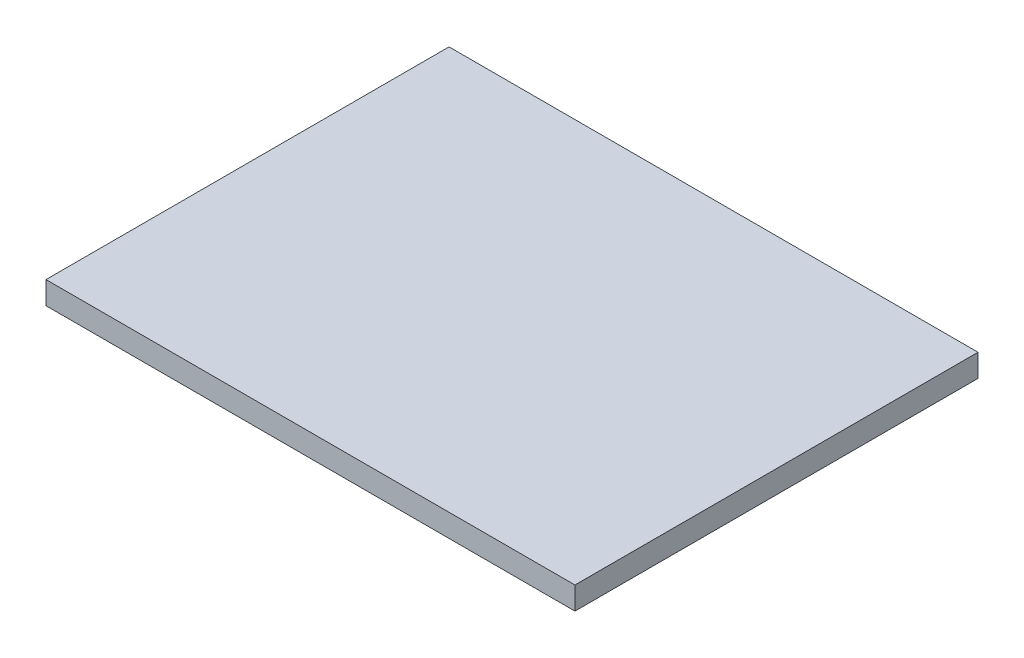
ISO-10303-21;
HEADER;
FILE_DESCRIPTION(('STEP AP214'),'2;1');
FILE_NAME('part.step','',(''),(''),'','','');
FILE_SCHEMA(('AUTOMOTIVE_DESIGN { 1 0 10303 214 1 1 1 1 }'));
ENDSEC;
DATA;
#1=APPLICATION_CONTEXT('core data for automotive mechanical design processes');
#2=APPLICATION_PROTOCOL_DEFINITION('international standard','automotive_design',2000,#1);
#3=PRODUCT_CONTEXT('',#1,'mechanical');
#4=PRODUCT('Part','Part','',(#3));
#5=PRODUCT_RELATED_PRODUCT_CATEGORY('part','',(#4));
#6=PRODUCT_DEFINITION_FORMATION('','',#4);
#7=PRODUCT_DEFINITION_CONTEXT('part definition',#1,'design');
#8=PRODUCT_DEFINITION('design','',#6,#7);
#9=PRODUCT_DEFINITION_SHAPE('','',#8);
#10=(LENGTH_UNIT() NAMED_UNIT(*) SI_UNIT(.MILLI.,.METRE.));
#11=(NAMED_UNIT(*) PLANE_ANGLE_UNIT() SI_UNIT($,.RADIAN.));
#12=(NAMED_UNIT(*) SI_UNIT($,.STERADIAN.) SOLID_ANGLE_UNIT());
#13=UNCERTAINTY_MEASURE_WITH_UNIT(LENGTH_MEASURE(1.E-05),#10,'distance_accuracy_value','');
#14=(GEOMETRIC_REPRESENTATION_CONTEXT(3) GLOBAL_UNCERTAINTY_ASSIGNED_CONTEXT((#13)) GLOBAL_UNIT_ASSIGNED_CONTEXT((#10,
#11,#12)) REPRESENTATION_CONTEXT('',''));
#15=CARTESIAN_POINT('',(0.,0.,0.));
#16=DIRECTION('',(0.,0.,1.));
#17=DIRECTION('',(1.,0.,0.));
#18=AXIS2_PLACEMENT_3D('',#15,#16,#17);
#19=CARTESIAN_POINT('',(5.698,2.9756,1.5049999999999));
#20=DIRECTION('',(1.,0.,0.));
#21=DIRECTION('',(0.,-1.,0.));
#22=AXIS2_PLACEMENT_3D('',#19,#20,#21);
#23=PLANE('',#22);
#24=DIRECTION('',(0.,0.,1.));
#25=VECTOR('',#24,1.);
#26=CARTESIAN_POINT('',(5.698,2.9306,1.5049999999999));
#27=LINE('',#26,#25);
#28=CARTESIAN_POINT('',(5.698,2.9306,0.704899999999952));
#29=VERTEX_POINT('',#28);
#30=CARTESIAN_POINT('',(5.698,2.9306,1.5049999999999));
#31=VERTEX_POINT('',#30);
#32=EDGE_CURVE('E11',#29,#31,#27,.T.);
#33=ORIENTED_EDGE('',*,*,#32,.T.);
#34=DIRECTION('',(0.,-1.,0.));
#35=VECTOR('',#34,1.);
#36=CARTESIAN_POINT('',(5.698,2.9756,1.5049999999999));
#37=LINE('',#36,#35);
#38=CARTESIAN_POINT('',(5.698,2.9756,1.5049999999999));
#39=VERTEX_POINT('',#38);
#40=EDGE_CURVE('E24',#39,#31,#37,.T.);
#41=ORIENTED_EDGE('',*,*,#40,.F.);
#42=DIRECTION('',(0.,0.,1.));
#43=VECTOR('',#42,1.);
#44=CARTESIAN_POINT('',(5.698,2.9756,1.5049999999999));
#45=LINE('',#44,#43);
#46=CARTESIAN_POINT('',(5.698,2.9756,0.704899999999952));
#47=VERTEX_POINT('',#46);
#48=EDGE_CURVE('E88',#47,#39,#45,.T.);
#49=ORIENTED_EDGE('',*,*,#48,.F.);
#50=DIRECTION('',(0.,-1.,0.));
#51=VECTOR('',#50,1.);
#52=CARTESIAN_POINT('',(5.698,2.9756,0.704899999999952));
#53=LINE('',#52,#51);
#54=EDGE_CURVE('E77',#47,#29,#53,.T.);
#55=ORIENTED_EDGE('',*,*,#54,.T.);
#56=EDGE_LOOP('',(#33,#41,#49,#55));
#57=FACE_BOUND('',#56,.T.);
#58=ADVANCED_FACE('F17',(#57),#23,.F.);
#59=CARTESIAN_POINT('',(6.748,2.9756,1.5049999999999));
#60=DIRECTION('',(0.,0.,-1.));
#61=DIRECTION('',(0.,1.,0.));
#62=AXIS2_PLACEMENT_3D('',#59,#60,#61);
#63=PLANE('',#62);
#64=DIRECTION('',(1.,0.,0.));
#65=VECTOR('',#64,1.);
#66=CARTESIAN_POINT('',(6.748,2.9306,1.5049999999999));
#67=LINE('',#66,#65);
#68=CARTESIAN_POINT('',(6.748,2.9306,1.5049999999999));
#69=VERTEX_POINT('',#68);
#70=EDGE_CURVE('E85',#31,#69,#67,.T.);
#71=ORIENTED_EDGE('',*,*,#70,.T.);
#72=DIRECTION('',(0.,-1.,0.));
#73=VECTOR('',#72,1.);
#74=CARTESIAN_POINT('',(6.748,2.9756,1.5049999999999));
#75=LINE('',#74,#73);
#76=CARTESIAN_POINT('',(6.748,2.9756,1.5049999999999));
#77=VERTEX_POINT('',#76);
#78=EDGE_CURVE('E83',#77,#69,#75,.T.);
#79=ORIENTED_EDGE('',*,*,#78,.F.);
#80=DIRECTION('',(1.,0.,0.));
#81=VECTOR('',#80,1.);
#82=CARTESIAN_POINT('',(6.748,2.9756,1.5049999999999));
#83=LINE('',#82,#81);
#84=EDGE_CURVE('E72',#39,#77,#83,.T.);
#85=ORIENTED_EDGE('',*,*,#84,.F.);
#86=ORIENTED_EDGE('',*,*,#40,.T.);
#87=EDGE_LOOP('',(#71,#79,#85,#86));
#88=FACE_BOUND('',#87,.T.);
#89=ADVANCED_FACE('F90',(#88),#63,.F.);
#90=CARTESIAN_POINT('',(6.748,2.9756,0.704899999999952));
#91=DIRECTION('',(-1.,0.,0.));
#92=DIRECTION('',(0.,1.,0.));
#93=AXIS2_PLACEMENT_3D('',#90,#91,#92);
#94=PLANE('',#93);
#95=DIRECTION('',(0.,0.,-1.));
#96=VECTOR('',#95,1.);
#97=CARTESIAN_POINT('',(6.748,2.9306,0.704899999999952));
#98=LINE('',#97,#96);
#99=CARTESIAN_POINT('',(6.748,2.9306,0.704899999999952));
#100=VERTEX_POINT('',#99);
#101=EDGE_CURVE('E60',#69,#100,#98,.T.);
#102=ORIENTED_EDGE('',*,*,#101,.T.);
#103=DIRECTION('',(0.,-1.,0.));
#104=VECTOR('',#103,1.);
#105=CARTESIAN_POINT('',(6.748,2.9756,0.704899999999952));
#106=LINE('',#105,#104);
#107=CARTESIAN_POINT('',(6.748,2.9756,0.704899999999952));
#108=VERTEX_POINT('',#107);
#109=EDGE_CURVE('E54',#108,#100,#106,.T.);
#110=ORIENTED_EDGE('',*,*,#109,.F.);
#111=DIRECTION('',(0.,0.,-1.));
#112=VECTOR('',#111,1.);
#113=CARTESIAN_POINT('',(6.748,2.9756,0.704899999999952));
#114=LINE('',#113,#112);
#115=EDGE_CURVE('E58',#77,#108,#114,.T.);
#116=ORIENTED_EDGE('',*,*,#115,.F.);
#117=ORIENTED_EDGE('',*,*,#78,.T.);
#118=EDGE_LOOP('',(#102,#110,#116,#117));
#119=FACE_BOUND('',#118,.T.);
#120=ADVANCED_FACE('F56',(#119),#94,.F.);
#121=CARTESIAN_POINT('',(5.698,2.9756,0.704899999999952));
#122=DIRECTION('',(0.,0.,1.));
#123=DIRECTION('',(0.,-1.,0.));
#124=AXIS2_PLACEMENT_3D('',#121,#122,#123);
#125=PLANE('',#124);
#126=DIRECTION('',(-1.,0.,0.));
#127=VECTOR('',#126,1.);
#128=CARTESIAN_POINT('',(5.698,2.9306,0.704899999999952));
#129=LINE('',#128,#127);
#130=EDGE_CURVE('E73',#100,#29,#129,.T.);
#131=ORIENTED_EDGE('',*,*,#130,.T.);
#132=ORIENTED_EDGE('',*,*,#54,.F.);
#133=DIRECTION('',(-1.,0.,0.));
#134=VECTOR('',#133,1.);
#135=CARTESIAN_POINT('',(5.698,2.9756,0.704899999999952));
#136=LINE('',#135,#134);
#137=EDGE_CURVE('E70',#108,#47,#136,.T.);
#138=ORIENTED_EDGE('',*,*,#137,.F.);
#139=ORIENTED_EDGE('',*,*,#109,.T.);
#140=EDGE_LOOP('',(#131,#132,#138,#139));
#141=FACE_BOUND('',#140,.T.);
#142=ADVANCED_FACE('F76',(#141),#125,.F.);
#143=CARTESIAN_POINT('',(0.,2.9756,0.));
#144=DIRECTION('',(0.,-1.,0.));
#145=DIRECTION('',(-1.,0.,0.));
#146=AXIS2_PLACEMENT_3D('',#143,#144,#145);
#147=PLANE('',#146);
#148=ORIENTED_EDGE('',*,*,#48,.T.);
#149=ORIENTED_EDGE('',*,*,#84,.T.);
#150=ORIENTED_EDGE('',*,*,#115,.T.);
#151=ORIENTED_EDGE('',*,*,#137,.T.);
#152=EDGE_LOOP('',(#148,#149,#150,#151));
#153=FACE_BOUND('',#152,.T.);
#154=ADVANCED_FACE('F69',(#153),#147,.F.);
#155=CARTESIAN_POINT('',(0.,2.9306,0.));
#156=DIRECTION('',(0.,-1.,0.));
#157=DIRECTION('',(-1.,0.,0.));
#158=AXIS2_PLACEMENT_3D('',#155,#156,#157);
#159=PLANE('',#158);
#160=ORIENTED_EDGE('',*,*,#32,.F.);
#161=ORIENTED_EDGE('',*,*,#130,.F.);
#162=ORIENTED_EDGE('',*,*,#101,.F.);
#163=ORIENTED_EDGE('',*,*,#70,.F.);
#164=EDGE_LOOP('',(#160,#161,#162,#163));
#165=FACE_BOUND('',#164,.T.);
#166=ADVANCED_FACE('F91',(#165),#159,.T.);
#167=CLOSED_SHELL('',(#58,#89,#120,#142,#154,#166));
#168=MANIFOLD_SOLID_BREP('B1',#167);
#169=ADVANCED_BREP_SHAPE_REPRESENTATION('',(#18,#168),#14);
#170=SHAPE_DEFINITION_REPRESENTATION(#9,#169);
ENDSEC;
END-ISO-10303-21;
